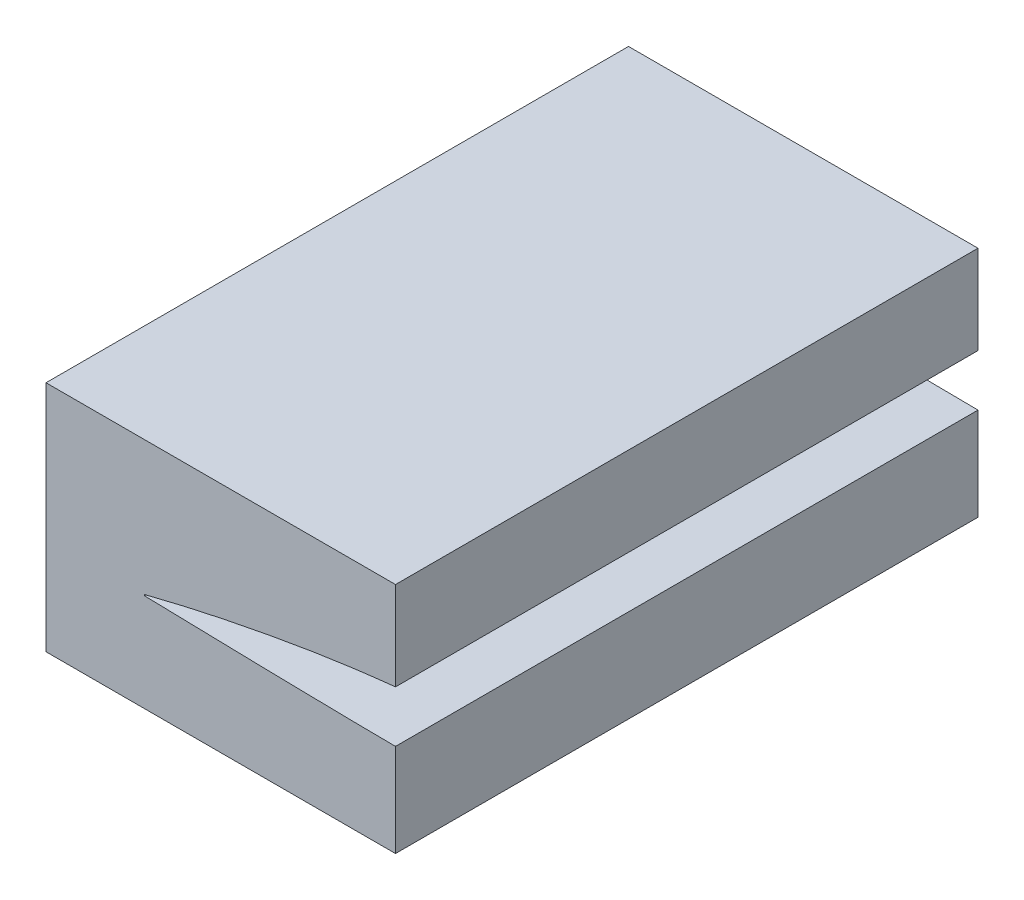
ISO-10303-21;
HEADER;
FILE_DESCRIPTION(('STEP AP214'),'2;1');
FILE_NAME('part.step','',(''),(''),'','','');
FILE_SCHEMA(('AUTOMOTIVE_DESIGN { 1 0 10303 214 1 1 1 1 }'));
ENDSEC;
DATA;
#1=APPLICATION_CONTEXT('core data for automotive mechanical design processes');
#2=APPLICATION_PROTOCOL_DEFINITION('international standard','automotive_design',2000,#1);
#3=PRODUCT_CONTEXT('',#1,'mechanical');
#4=PRODUCT('Part','Part','',(#3));
#5=PRODUCT_RELATED_PRODUCT_CATEGORY('part','',(#4));
#6=PRODUCT_DEFINITION_FORMATION('','',#4);
#7=PRODUCT_DEFINITION_CONTEXT('part definition',#1,'design');
#8=PRODUCT_DEFINITION('design','',#6,#7);
#9=PRODUCT_DEFINITION_SHAPE('','',#8);
#10=(LENGTH_UNIT() NAMED_UNIT(*) SI_UNIT(.MILLI.,.METRE.));
#11=(NAMED_UNIT(*) PLANE_ANGLE_UNIT() SI_UNIT($,.RADIAN.));
#12=(NAMED_UNIT(*) SI_UNIT($,.STERADIAN.) SOLID_ANGLE_UNIT());
#13=UNCERTAINTY_MEASURE_WITH_UNIT(LENGTH_MEASURE(1.E-05),#10,'distance_accuracy_value','');
#14=(GEOMETRIC_REPRESENTATION_CONTEXT(3) GLOBAL_UNCERTAINTY_ASSIGNED_CONTEXT((#13)) GLOBAL_UNIT_ASSIGNED_CONTEXT((#10,
#11,#12)) REPRESENTATION_CONTEXT('',''));
#15=CARTESIAN_POINT('',(0.,0.,0.));
#16=DIRECTION('',(0.,0.,1.));
#17=DIRECTION('',(1.,0.,0.));
#18=AXIS2_PLACEMENT_3D('',#15,#16,#17);
#19=CARTESIAN_POINT('',(-29.9999999999997,13.,50.));
#20=DIRECTION('',(1.,0.,0.));
#21=DIRECTION('',(0.,0.,-1.));
#22=AXIS2_PLACEMENT_3D('',#19,#20,#21);
#23=PLANE('',#22);
#24=DIRECTION('',(0.,-1.,0.));
#25=VECTOR('',#24,1.);
#26=CARTESIAN_POINT('',(-29.9999999999997,13.,0.));
#27=LINE('',#26,#25);
#28=CARTESIAN_POINT('',(-29.9999999999997,13.,0.));
#29=VERTEX_POINT('',#28);
#30=CARTESIAN_POINT('',(-29.9999999999997,-7.,0.));
#31=VERTEX_POINT('',#30);
#32=EDGE_CURVE('E149',#29,#31,#27,.T.);
#33=ORIENTED_EDGE('',*,*,#32,.T.);
#34=DIRECTION('',(0.,0.,-1.));
#35=VECTOR('',#34,1.);
#36=CARTESIAN_POINT('',(-29.9999999999997,-7.,50.));
#37=LINE('',#36,#35);
#38=CARTESIAN_POINT('',(-29.9999999999997,-7.,50.));
#39=VERTEX_POINT('',#38);
#40=EDGE_CURVE('E11',#39,#31,#37,.T.);
#41=ORIENTED_EDGE('',*,*,#40,.F.);
#42=DIRECTION('',(0.,-1.,0.));
#43=VECTOR('',#42,1.);
#44=CARTESIAN_POINT('',(-29.9999999999997,13.,50.));
#45=LINE('',#44,#43);
#46=CARTESIAN_POINT('',(-29.9999999999997,13.,50.));
#47=VERTEX_POINT('',#46);
#48=EDGE_CURVE('E187',#47,#39,#45,.T.);
#49=ORIENTED_EDGE('',*,*,#48,.F.);
#50=DIRECTION('',(0.,0.,-1.));
#51=VECTOR('',#50,1.);
#52=CARTESIAN_POINT('',(-29.9999999999997,13.,50.));
#53=LINE('',#52,#51);
#54=EDGE_CURVE('E62',#47,#29,#53,.T.);
#55=ORIENTED_EDGE('',*,*,#54,.T.);
#56=EDGE_LOOP('',(#33,#41,#49,#55));
#57=FACE_BOUND('',#56,.T.);
#58=ADVANCED_FACE('F45',(#57),#23,.F.);
#59=CARTESIAN_POINT('',(-29.9999999999997,-7.,50.));
#60=DIRECTION('',(0.,1.,0.));
#61=DIRECTION('',(0.,0.,1.));
#62=AXIS2_PLACEMENT_3D('',#59,#60,#61);
#63=PLANE('',#62);
#64=DIRECTION('',(1.,0.,0.));
#65=VECTOR('',#64,1.);
#66=CARTESIAN_POINT('',(-29.9999999999997,-7.,0.));
#67=LINE('',#66,#65);
#68=CARTESIAN_POINT('',(2.8796409701215E-13,-7.,0.));
#69=VERTEX_POINT('',#68);
#70=EDGE_CURVE('E152',#31,#69,#67,.T.);
#71=ORIENTED_EDGE('',*,*,#70,.T.);
#72=DIRECTION('',(0.,0.,-1.));
#73=VECTOR('',#72,1.);
#74=CARTESIAN_POINT('',(2.8796409701215E-13,-7.,50.));
#75=LINE('',#74,#73);
#76=CARTESIAN_POINT('',(2.8796409701215E-13,-7.,50.));
#77=VERTEX_POINT('',#76);
#78=EDGE_CURVE('E54',#77,#69,#75,.T.);
#79=ORIENTED_EDGE('',*,*,#78,.F.);
#80=DIRECTION('',(1.,0.,0.));
#81=VECTOR('',#80,1.);
#82=CARTESIAN_POINT('',(-29.9999999999997,-7.,50.));
#83=LINE('',#82,#81);
#84=EDGE_CURVE('E101',#39,#77,#83,.T.);
#85=ORIENTED_EDGE('',*,*,#84,.F.);
#86=ORIENTED_EDGE('',*,*,#40,.T.);
#87=EDGE_LOOP('',(#71,#79,#85,#86));
#88=FACE_BOUND('',#87,.T.);
#89=ADVANCED_FACE('F206',(#88),#63,.F.);
#90=CARTESIAN_POINT('',(0.,0.968636760709384,50.));
#91=DIRECTION('',(1.,0.,0.));
#92=DIRECTION('',(0.,1.,0.));
#93=AXIS2_PLACEMENT_3D('',#90,#91,#92);
#94=PLANE('',#93);
#95=DIRECTION('',(0.,-1.,0.));
#96=VECTOR('',#95,1.);
#97=CARTESIAN_POINT('',(0.,0.968636760709384,0.));
#98=LINE('',#97,#96);
#99=CARTESIAN_POINT('',(2.91433543964104E-13,0.968636760709384,0.));
#100=VERTEX_POINT('',#99);
#101=EDGE_CURVE('E156',#100,#69,#98,.T.);
#102=ORIENTED_EDGE('',*,*,#101,.F.);
#103=DIRECTION('',(0.,0.,-1.));
#104=VECTOR('',#103,1.);
#105=CARTESIAN_POINT('',(2.91433543964104E-13,0.968636760709384,50.));
#106=LINE('',#105,#104);
#107=CARTESIAN_POINT('',(2.91433543964104E-13,0.968636760709384,50.));
#108=VERTEX_POINT('',#107);
#109=EDGE_CURVE('E197',#108,#100,#106,.T.);
#110=ORIENTED_EDGE('',*,*,#109,.F.);
#111=DIRECTION('',(0.,-1.,0.));
#112=VECTOR('',#111,1.);
#113=CARTESIAN_POINT('',(0.,0.968636760709384,50.));
#114=LINE('',#113,#112);
#115=EDGE_CURVE('E205',#108,#77,#114,.T.);
#116=ORIENTED_EDGE('',*,*,#115,.T.);
#117=ORIENTED_EDGE('',*,*,#78,.T.);
#118=EDGE_LOOP('',(#102,#110,#116,#117));
#119=FACE_BOUND('',#118,.T.);
#120=ADVANCED_FACE('F203',(#119),#94,.T.);
#121=CARTESIAN_POINT('',(2.91433543964104E-13,0.968636760709384,50.));
#122=CARTESIAN_POINT('',(-0.491168758583731,0.970701913286248,50.));
#123=CARTESIAN_POINT('',(-2.31788963490718,0.983079263282352,50.));
#124=CARTESIAN_POINT('',(-5.4801499370529,1.03434695248438,50.));
#125=CARTESIAN_POINT('',(-9.48697437201855,1.10869611863599,50.));
#126=CARTESIAN_POINT('',(-13.4946147562153,1.18605498650635,50.));
#127=CARTESIAN_POINT('',(-16.8341832134372,1.2726468366888,50.));
#128=CARTESIAN_POINT('',(-19.5063687605814,1.33523150019094,50.));
#129=CARTESIAN_POINT('',(-20.8423934543762,1.37107237129395,50.));
#130=CARTESIAN_POINT('',(-21.5104516756719,1.38899403749516,50.));
#131=B_SPLINE_CURVE_WITH_KNOTS('',3,(#121,#122,#123,#124,#125,#126,#127,#128,#129,#130),
.UNSPECIFIED.,.F.,.F.,(4,1,1,1,1,1,1,4),(0.73625719822174,0.754320378530032,0.803437363555032,
0.852566095729537,0.901700994033254,0.95084880933727,0.975422716989278,1.),.UNSPECIFIED.);
#132=DIRECTION('',(0.,0.,-1.));
#133=VECTOR('',#132,1.);
#134=SURFACE_OF_LINEAR_EXTRUSION('',#131,#133);
#135=CARTESIAN_POINT('',(2.91433543964104E-13,0.968636760709384,0.));
#136=CARTESIAN_POINT('',(-0.491168758583731,0.970701913286248,0.));
#137=CARTESIAN_POINT('',(-2.31788963490718,0.983079263282352,0.));
#138=CARTESIAN_POINT('',(-5.4801499370529,1.03434695248438,0.));
#139=CARTESIAN_POINT('',(-9.48697437201855,1.10869611863599,0.));
#140=CARTESIAN_POINT('',(-13.4946147562153,1.18605498650635,0.));
#141=CARTESIAN_POINT('',(-16.8341832134372,1.2726468366888,0.));
#142=CARTESIAN_POINT('',(-19.5063687605814,1.33523150019094,0.));
#143=CARTESIAN_POINT('',(-20.8423934543762,1.37107237129395,0.));
#144=CARTESIAN_POINT('',(-21.5104516756719,1.38899403749516,0.));
#145=B_SPLINE_CURVE_WITH_KNOTS('',3,(#135,#136,#137,#138,#139,#140,#141,#142,#143,#144),
.UNSPECIFIED.,.F.,.F.,(4,1,1,1,1,1,1,4),(0.73625719822174,0.754320378530032,0.803437363555032,
0.852566095729537,0.901700994033254,0.95084880933727,0.975422716989278,1.),.UNSPECIFIED.);
#146=CARTESIAN_POINT('',(-21.5104516756719,1.38899403749516,0.));
#147=VERTEX_POINT('',#146);
#148=EDGE_CURVE('E160',#100,#147,#145,.T.);
#149=ORIENTED_EDGE('',*,*,#148,.T.);
#150=DIRECTION('',(0.,0.,-1.));
#151=VECTOR('',#150,1.);
#152=CARTESIAN_POINT('',(-21.5104516756719,1.38899403749516,50.));
#153=LINE('',#152,#151);
#154=CARTESIAN_POINT('',(-21.5104516756719,1.38899403749516,50.));
#155=VERTEX_POINT('',#154);
#156=EDGE_CURVE('E194',#155,#147,#153,.T.);
#157=ORIENTED_EDGE('',*,*,#156,.F.);
#158=EDGE_CURVE('E216',#108,#155,#131,.T.);
#159=ORIENTED_EDGE('',*,*,#158,.F.);
#160=ORIENTED_EDGE('',*,*,#109,.T.);
#161=EDGE_LOOP('',(#149,#157,#159,#160));
#162=FACE_BOUND('',#161,.T.);
#163=ADVANCED_FACE('F214',(#162),#134,.F.);
#164=CARTESIAN_POINT('',(-21.5018512212023,1.44141908107357,50.));
#165=DIRECTION('',(0.,0.,-1.));
#166=DIRECTION('',(-1.,0.,0.));
#167=AXIS2_PLACEMENT_3D('',#164,#165,#166);
#168=CYLINDRICAL_SURFACE('',#167,0.0531258224527449);
#169=CARTESIAN_POINT('',(-21.5018512212023,1.44141908107357,0.));
#170=DIRECTION('',(0.,0.,1.));
#171=DIRECTION('',(1.,0.,0.));
#172=AXIS2_PLACEMENT_3D('',#169,#170,#171);
#173=CIRCLE('',#172,0.0531258224527449);
#174=CARTESIAN_POINT('',(-21.5149880919601,1.49289505253574,0.));
#175=VERTEX_POINT('',#174);
#176=EDGE_CURVE('E166',#175,#147,#173,.T.);
#177=ORIENTED_EDGE('',*,*,#176,.F.);
#178=DIRECTION('',(0.,0.,-1.));
#179=VECTOR('',#178,1.);
#180=CARTESIAN_POINT('',(-21.5149880919601,1.49289505253574,50.));
#181=LINE('',#180,#179);
#182=CARTESIAN_POINT('',(-21.5149880919601,1.49289505253574,50.));
#183=VERTEX_POINT('',#182);
#184=EDGE_CURVE('E136',#183,#175,#181,.T.);
#185=ORIENTED_EDGE('',*,*,#184,.F.);
#186=CARTESIAN_POINT('',(-21.5018512212023,1.44141908107357,50.));
#187=DIRECTION('',(0.,0.,1.));
#188=DIRECTION('',(1.,0.,0.));
#189=AXIS2_PLACEMENT_3D('',#186,#187,#188);
#190=CIRCLE('',#189,0.0531258224527449);
#191=EDGE_CURVE('E124',#183,#155,#190,.T.);
#192=ORIENTED_EDGE('',*,*,#191,.T.);
#193=ORIENTED_EDGE('',*,*,#156,.T.);
#194=EDGE_LOOP('',(#177,#185,#192,#193));
#195=FACE_BOUND('',#194,.T.);
#196=ADVANCED_FACE('F234',(#195),#168,.F.);
#197=CARTESIAN_POINT('',(-21.5149880919601,1.49289505253574,50.));
#198=CARTESIAN_POINT('',(-20.8552808528791,1.65836191020002,50.));
#199=CARTESIAN_POINT('',(-19.5375990438517,1.98886103985163,50.));
#200=CARTESIAN_POINT('',(-16.8979493868394,2.60408897391435,50.));
#201=CARTESIAN_POINT('',(-13.593500709864,3.30234073337041,50.));
#202=CARTESIAN_POINT('',(-9.62153504930453,4.04911257793303,50.));
#203=CARTESIAN_POINT('',(-5.64608020990739,4.70083913220641,50.));
#204=CARTESIAN_POINT('',(-2.43613795826308,5.12316360434077,50.));
#205=CARTESIAN_POINT('',(-0.553103119155386,5.33293400053691,50.));
#206=CARTESIAN_POINT('',(-4.37185010415675E-11,5.3903572489264,50.));
#207=B_SPLINE_CURVE_WITH_KNOTS('',3,(#197,#198,#199,#200,#201,#202,#203,#204,#205,#206),
.UNSPECIFIED.,.F.,.F.,(4,1,1,1,1,1,1,4),(0.,0.0250124897498648,0.0499592861642578,
0.0996729249269685,0.149206319909966,0.198581096615965,0.247805170456832,0.268254550039393),.UNSPECIFIED.);
#208=DIRECTION('',(0.,0.,-1.));
#209=VECTOR('',#208,1.);
#210=SURFACE_OF_LINEAR_EXTRUSION('',#207,#209);
#211=CARTESIAN_POINT('',(-21.5149880919601,1.49289505253574,0.));
#212=CARTESIAN_POINT('',(-20.8552808528791,1.65836191020002,0.));
#213=CARTESIAN_POINT('',(-19.5375990438517,1.98886103985163,0.));
#214=CARTESIAN_POINT('',(-16.8979493868394,2.60408897391435,0.));
#215=CARTESIAN_POINT('',(-13.593500709864,3.30234073337041,0.));
#216=CARTESIAN_POINT('',(-9.62153504930453,4.04911257793303,0.));
#217=CARTESIAN_POINT('',(-5.64608020990739,4.70083913220641,0.));
#218=CARTESIAN_POINT('',(-2.43613795826308,5.12316360434077,0.));
#219=CARTESIAN_POINT('',(-0.553103119155386,5.33293400053691,0.));
#220=CARTESIAN_POINT('',(-4.37185010415675E-11,5.3903572489264,0.));
#221=B_SPLINE_CURVE_WITH_KNOTS('',3,(#211,#212,#213,#214,#215,#216,#217,#218,#219,#220),
.UNSPECIFIED.,.F.,.F.,(4,1,1,1,1,1,1,4),(0.,0.0250124897498648,0.0499592861642578,
0.0996729249269685,0.149206319909966,0.198581096615965,0.247805170456832,0.268254550039393),.UNSPECIFIED.);
#222=CARTESIAN_POINT('',(-4.37185010415675E-11,5.3903572489264,0.));
#223=VERTEX_POINT('',#222);
#224=EDGE_CURVE('E132',#175,#223,#221,.T.);
#225=ORIENTED_EDGE('',*,*,#224,.T.);
#226=DIRECTION('',(0.,0.,-1.));
#227=VECTOR('',#226,1.);
#228=CARTESIAN_POINT('',(-4.37185010415675E-11,5.3903572489264,50.));
#229=LINE('',#228,#227);
#230=CARTESIAN_POINT('',(-4.37185010415675E-11,5.3903572489264,50.));
#231=VERTEX_POINT('',#230);
#232=EDGE_CURVE('E129',#231,#223,#229,.T.);
#233=ORIENTED_EDGE('',*,*,#232,.F.);
#234=EDGE_CURVE('E117',#183,#231,#207,.T.);
#235=ORIENTED_EDGE('',*,*,#234,.F.);
#236=ORIENTED_EDGE('',*,*,#184,.T.);
#237=EDGE_LOOP('',(#225,#233,#235,#236));
#238=FACE_BOUND('',#237,.T.);
#239=ADVANCED_FACE('F130',(#238),#210,.F.);
#240=CARTESIAN_POINT('',(-4.37185010415675E-11,5.3903572489264,50.));
#241=DIRECTION('',(-1.,0.,0.));
#242=DIRECTION('',(0.,0.,1.));
#243=AXIS2_PLACEMENT_3D('',#240,#241,#242);
#244=PLANE('',#243);
#245=DIRECTION('',(0.,1.,0.));
#246=VECTOR('',#245,1.);
#247=CARTESIAN_POINT('',(-4.37185010415675E-11,5.3903572489264,0.));
#248=LINE('',#247,#246);
#249=CARTESIAN_POINT('',(-4.37185010415675E-11,13.,0.));
#250=VERTEX_POINT('',#249);
#251=EDGE_CURVE('E177',#223,#250,#248,.T.);
#252=ORIENTED_EDGE('',*,*,#251,.T.);
#253=DIRECTION('',(0.,0.,-1.));
#254=VECTOR('',#253,1.);
#255=CARTESIAN_POINT('',(-4.37185010415675E-11,13.,50.));
#256=LINE('',#255,#254);
#257=CARTESIAN_POINT('',(-4.37185010415675E-11,13.,50.));
#258=VERTEX_POINT('',#257);
#259=EDGE_CURVE('E89',#258,#250,#256,.T.);
#260=ORIENTED_EDGE('',*,*,#259,.F.);
#261=DIRECTION('',(0.,1.,0.));
#262=VECTOR('',#261,1.);
#263=CARTESIAN_POINT('',(-4.37185010415675E-11,5.3903572489264,50.));
#264=LINE('',#263,#262);
#265=EDGE_CURVE('E122',#231,#258,#264,.T.);
#266=ORIENTED_EDGE('',*,*,#265,.F.);
#267=ORIENTED_EDGE('',*,*,#232,.T.);
#268=EDGE_LOOP('',(#252,#260,#266,#267));
#269=FACE_BOUND('',#268,.T.);
#270=ADVANCED_FACE('F138',(#269),#244,.F.);
#271=CARTESIAN_POINT('',(-29.9999999999997,13.,50.));
#272=DIRECTION('',(0.,1.,0.));
#273=DIRECTION('',(0.,0.,1.));
#274=AXIS2_PLACEMENT_3D('',#271,#272,#273);
#275=PLANE('',#274);
#276=DIRECTION('',(1.,0.,0.));
#277=VECTOR('',#276,1.);
#278=CARTESIAN_POINT('',(-29.9999999999997,13.,0.));
#279=LINE('',#278,#277);
#280=EDGE_CURVE('E183',#29,#250,#279,.T.);
#281=ORIENTED_EDGE('',*,*,#280,.F.);
#282=ORIENTED_EDGE('',*,*,#54,.F.);
#283=DIRECTION('',(1.,0.,0.));
#284=VECTOR('',#283,1.);
#285=CARTESIAN_POINT('',(-29.9999999999997,13.,50.));
#286=LINE('',#285,#284);
#287=EDGE_CURVE('E140',#47,#258,#286,.T.);
#288=ORIENTED_EDGE('',*,*,#287,.T.);
#289=ORIENTED_EDGE('',*,*,#259,.T.);
#290=EDGE_LOOP('',(#281,#282,#288,#289));
#291=FACE_BOUND('',#290,.T.);
#292=ADVANCED_FACE('F243',(#291),#275,.T.);
#293=CARTESIAN_POINT('',(-10.7560847228426,1.13349335191398,50.));
#294=DIRECTION('',(0.,0.,1.));
#295=DIRECTION('',(1.,0.,0.));
#296=AXIS2_PLACEMENT_3D('',#293,#294,#295);
#297=PLANE('',#296);
#298=ORIENTED_EDGE('',*,*,#48,.T.);
#299=ORIENTED_EDGE('',*,*,#84,.T.);
#300=ORIENTED_EDGE('',*,*,#115,.F.);
#301=ORIENTED_EDGE('',*,*,#158,.T.);
#302=ORIENTED_EDGE('',*,*,#191,.F.);
#303=ORIENTED_EDGE('',*,*,#234,.T.);
#304=ORIENTED_EDGE('',*,*,#265,.T.);
#305=ORIENTED_EDGE('',*,*,#287,.F.);
#306=EDGE_LOOP('',(#298,#299,#300,#301,#302,#303,#304,#305));
#307=FACE_BOUND('',#306,.T.);
#308=ADVANCED_FACE('F119',(#307),#297,.T.);
#309=CARTESIAN_POINT('',(-10.7560847228426,1.13349335191398,0.));
#310=DIRECTION('',(0.,0.,1.));
#311=DIRECTION('',(1.,0.,0.));
#312=AXIS2_PLACEMENT_3D('',#309,#310,#311);
#313=PLANE('',#312);
#314=ORIENTED_EDGE('',*,*,#32,.F.);
#315=ORIENTED_EDGE('',*,*,#280,.T.);
#316=ORIENTED_EDGE('',*,*,#251,.F.);
#317=ORIENTED_EDGE('',*,*,#224,.F.);
#318=ORIENTED_EDGE('',*,*,#176,.T.);
#319=ORIENTED_EDGE('',*,*,#148,.F.);
#320=ORIENTED_EDGE('',*,*,#101,.T.);
#321=ORIENTED_EDGE('',*,*,#70,.F.);
#322=EDGE_LOOP('',(#314,#315,#316,#317,#318,#319,#320,#321));
#323=FACE_BOUND('',#322,.T.);
#324=ADVANCED_FACE('F210',(#323),#313,.F.);
#325=CLOSED_SHELL('',(#58,#89,#120,#163,#196,#239,#270,#292,#308,#324));
#326=MANIFOLD_SOLID_BREP('B2',#325);
#327=ADVANCED_BREP_SHAPE_REPRESENTATION('',(#18,#326),#14);
#328=SHAPE_DEFINITION_REPRESENTATION(#9,#327);
ENDSEC;
END-ISO-10303-21;
